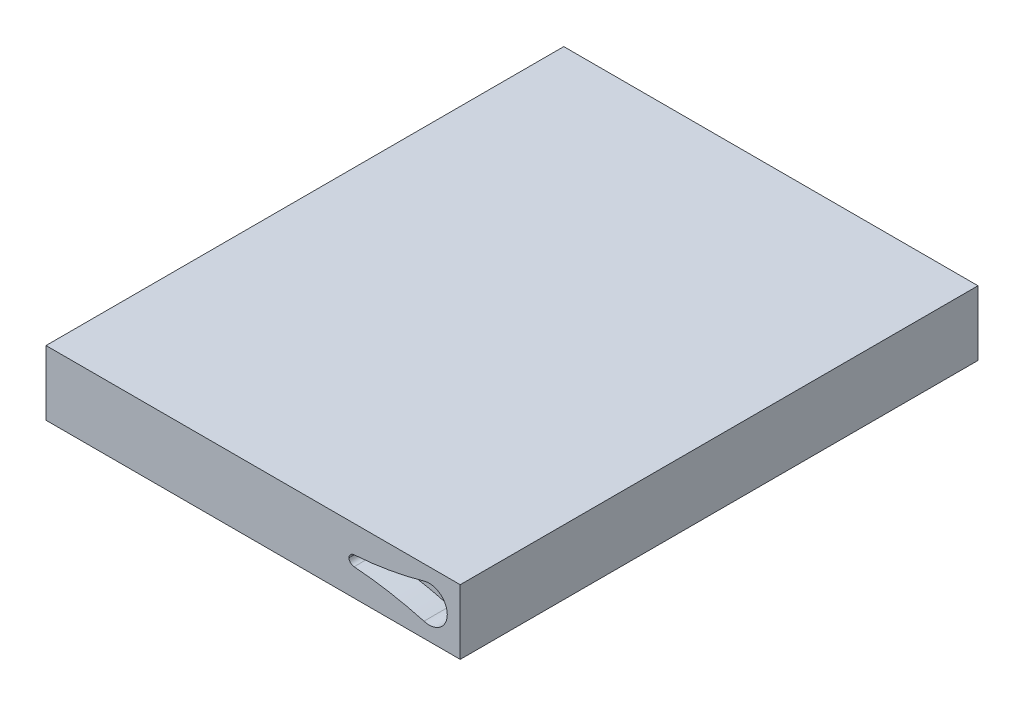
ISO-10303-21;
HEADER;
FILE_DESCRIPTION(('STEP AP214'),'2;1');
FILE_NAME('part.step','',(''),(''),'','','');
FILE_SCHEMA(('AUTOMOTIVE_DESIGN { 1 0 10303 214 1 1 1 1 }'));
ENDSEC;
DATA;
#1=APPLICATION_CONTEXT('core data for automotive mechanical design processes');
#2=APPLICATION_PROTOCOL_DEFINITION('international standard','automotive_design',2000,#1);
#3=PRODUCT_CONTEXT('',#1,'mechanical');
#4=PRODUCT('Part','Part','',(#3));
#5=PRODUCT_RELATED_PRODUCT_CATEGORY('part','',(#4));
#6=PRODUCT_DEFINITION_FORMATION('','',#4);
#7=PRODUCT_DEFINITION_CONTEXT('part definition',#1,'design');
#8=PRODUCT_DEFINITION('design','',#6,#7);
#9=PRODUCT_DEFINITION_SHAPE('','',#8);
#10=(LENGTH_UNIT() NAMED_UNIT(*) SI_UNIT(.MILLI.,.METRE.));
#11=(NAMED_UNIT(*) PLANE_ANGLE_UNIT() SI_UNIT($,.RADIAN.));
#12=(NAMED_UNIT(*) SI_UNIT($,.STERADIAN.) SOLID_ANGLE_UNIT());
#13=UNCERTAINTY_MEASURE_WITH_UNIT(LENGTH_MEASURE(1.E-05),#10,'distance_accuracy_value','');
#14=(GEOMETRIC_REPRESENTATION_CONTEXT(3) GLOBAL_UNCERTAINTY_ASSIGNED_CONTEXT((#13)) GLOBAL_UNIT_ASSIGNED_CONTEXT((#10,
#11,#12)) REPRESENTATION_CONTEXT('',''));
#15=CARTESIAN_POINT('',(0.,0.,0.));
#16=DIRECTION('',(0.,0.,1.));
#17=DIRECTION('',(1.,0.,0.));
#18=AXIS2_PLACEMENT_3D('',#15,#16,#17);
#19=CARTESIAN_POINT('',(0.,12.5,0.));
#20=DIRECTION('',(0.,0.,-1.));
#21=DIRECTION('',(-1.,0.,0.));
#22=AXIS2_PLACEMENT_3D('',#19,#20,#21);
#23=PLANE('',#22);
#24=DIRECTION('',(1.,0.,0.));
#25=VECTOR('',#24,1.);
#26=CARTESIAN_POINT('',(0.,0.,0.));
#27=LINE('',#26,#25);
#28=CARTESIAN_POINT('',(0.,0.,0.));
#29=VERTEX_POINT('',#28);
#30=CARTESIAN_POINT('',(80.,0.,0.));
#31=VERTEX_POINT('',#30);
#32=EDGE_CURVE('E262',#29,#31,#27,.T.);
#33=ORIENTED_EDGE('',*,*,#32,.T.);
#34=DIRECTION('',(0.,-1.,0.));
#35=VECTOR('',#34,1.);
#36=CARTESIAN_POINT('',(80.,12.5,0.));
#37=LINE('',#36,#35);
#38=CARTESIAN_POINT('',(80.,12.5,0.));
#39=VERTEX_POINT('',#38);
#40=EDGE_CURVE('E54',#39,#31,#37,.T.);
#41=ORIENTED_EDGE('',*,*,#40,.F.);
#42=DIRECTION('',(1.,0.,0.));
#43=VECTOR('',#42,1.);
#44=CARTESIAN_POINT('',(0.,12.5,0.));
#45=LINE('',#44,#43);
#46=CARTESIAN_POINT('',(0.,12.5,0.));
#47=VERTEX_POINT('',#46);
#48=EDGE_CURVE('E248',#47,#39,#45,.T.);
#49=ORIENTED_EDGE('',*,*,#48,.F.);
#50=DIRECTION('',(0.,-1.,0.));
#51=VECTOR('',#50,1.);
#52=CARTESIAN_POINT('',(0.,12.5,0.));
#53=LINE('',#52,#51);
#54=EDGE_CURVE('E11',#47,#29,#53,.T.);
#55=ORIENTED_EDGE('',*,*,#54,.T.);
#56=EDGE_LOOP('',(#33,#41,#49,#55));
#57=FACE_BOUND('',#56,.T.);
#58=CARTESIAN_POINT('',(59.5740057832264,6.17599421677323,0.));
#59=DIRECTION('',(0.,0.,1.));
#60=DIRECTION('',(1.,0.,0.));
#61=AXIS2_PLACEMENT_3D('',#58,#59,#60);
#62=CIRCLE('',#61,1.07655249679479);
#63=CARTESIAN_POINT('',(58.4999999999999,6.24999999999999,0.));
#64=VERTEX_POINT('',#63);
#65=CARTESIAN_POINT('',(59.5,7.24999999999981,0.));
#66=VERTEX_POINT('',#65);
#67=EDGE_CURVE('E69',#64,#66,#62,.F.);
#68=ORIENTED_EDGE('',*,*,#67,.T.);
#69=CARTESIAN_POINT('',(54.956020838334,73.1943044277108,0.));
#70=DIRECTION('',(0.,0.,1.));
#71=DIRECTION('',(1.,0.,0.));
#72=AXIS2_PLACEMENT_3D('',#69,#70,#71);
#73=CIRCLE('',#72,66.100673469158);
#74=CARTESIAN_POINT('',(73.,9.60410196624968,0.));
#75=VERTEX_POINT('',#74);
#76=EDGE_CURVE('E196',#66,#75,#73,.T.);
#77=ORIENTED_EDGE('',*,*,#76,.T.);
#78=CARTESIAN_POINT('',(74.,6.25,0.));
#79=DIRECTION('',(0.,0.,1.));
#80=DIRECTION('',(1.,0.,0.));
#81=AXIS2_PLACEMENT_3D('',#78,#79,#80);
#82=CIRCLE('',#81,3.50000000000001);
#83=CARTESIAN_POINT('',(73.,2.89589803375031,0.));
#84=VERTEX_POINT('',#83);
#85=EDGE_CURVE('E222',#84,#75,#82,.T.);
#86=ORIENTED_EDGE('',*,*,#85,.F.);
#87=CARTESIAN_POINT('',(54.2313452927929,-64.8500801778966,0.));
#88=DIRECTION('',(0.,0.,1.));
#89=DIRECTION('',(1.,0.,0.));
#90=AXIS2_PLACEMENT_3D('',#87,#88,#89);
#91=CIRCLE('',#90,70.2977948684829);
#92=CARTESIAN_POINT('',(59.5,5.25000000000005,0.));
#93=VERTEX_POINT('',#92);
#94=EDGE_CURVE('E218',#93,#84,#91,.F.);
#95=ORIENTED_EDGE('',*,*,#94,.F.);
#96=CARTESIAN_POINT('',(59.5812669884853,6.33126698848544,0.));
#97=DIRECTION('',(0.,0.,1.));
#98=DIRECTION('',(1.,0.,0.));
#99=AXIS2_PLACEMENT_3D('',#96,#97,#98);
#100=CIRCLE('',#99,1.08431666214522);
#101=EDGE_CURVE('E214',#64,#93,#100,.T.);
#102=ORIENTED_EDGE('',*,*,#101,.F.);
#103=EDGE_LOOP('',(#68,#77,#86,#95,#102));
#104=FACE_BOUND('',#103,.T.);
#105=ADVANCED_FACE('F45',(#57,#104),#23,.F.);
#106=CARTESIAN_POINT('',(0.,12.5,0.));
#107=DIRECTION('',(1.,0.,0.));
#108=DIRECTION('',(0.,0.,-1.));
#109=AXIS2_PLACEMENT_3D('',#106,#107,#108);
#110=PLANE('',#109);
#111=DIRECTION('',(0.,0.,1.));
#112=VECTOR('',#111,1.);
#113=CARTESIAN_POINT('',(0.,0.,0.));
#114=LINE('',#113,#112);
#115=CARTESIAN_POINT('',(0.,0.,-100.));
#116=VERTEX_POINT('',#115);
#117=EDGE_CURVE('E232',#116,#29,#114,.T.);
#118=ORIENTED_EDGE('',*,*,#117,.T.);
#119=ORIENTED_EDGE('',*,*,#54,.F.);
#120=DIRECTION('',(0.,0.,1.));
#121=VECTOR('',#120,1.);
#122=CARTESIAN_POINT('',(0.,12.5,0.));
#123=LINE('',#122,#121);
#124=CARTESIAN_POINT('',(0.,12.5,-100.));
#125=VERTEX_POINT('',#124);
#126=EDGE_CURVE('E244',#125,#47,#123,.T.);
#127=ORIENTED_EDGE('',*,*,#126,.F.);
#128=DIRECTION('',(0.,-1.,0.));
#129=VECTOR('',#128,1.);
#130=CARTESIAN_POINT('',(0.,12.5,-100.));
#131=LINE('',#130,#129);
#132=EDGE_CURVE('E258',#125,#116,#131,.T.);
#133=ORIENTED_EDGE('',*,*,#132,.T.);
#134=EDGE_LOOP('',(#118,#119,#127,#133));
#135=FACE_BOUND('',#134,.T.);
#136=ADVANCED_FACE('F47',(#135),#110,.F.);
#137=CARTESIAN_POINT('',(80.,12.5,0.));
#138=DIRECTION('',(-1.,0.,0.));
#139=DIRECTION('',(0.,0.,1.));
#140=AXIS2_PLACEMENT_3D('',#137,#138,#139);
#141=PLANE('',#140);
#142=DIRECTION('',(0.,0.,-1.));
#143=VECTOR('',#142,1.);
#144=CARTESIAN_POINT('',(80.,0.,0.));
#145=LINE('',#144,#143);
#146=CARTESIAN_POINT('',(80.,0.,-100.));
#147=VERTEX_POINT('',#146);
#148=EDGE_CURVE('E265',#31,#147,#145,.T.);
#149=ORIENTED_EDGE('',*,*,#148,.T.);
#150=DIRECTION('',(0.,-1.,0.));
#151=VECTOR('',#150,1.);
#152=CARTESIAN_POINT('',(80.,12.5,-100.));
#153=LINE('',#152,#151);
#154=CARTESIAN_POINT('',(80.,12.5,-100.));
#155=VERTEX_POINT('',#154);
#156=EDGE_CURVE('E273',#155,#147,#153,.T.);
#157=ORIENTED_EDGE('',*,*,#156,.F.);
#158=DIRECTION('',(0.,0.,-1.));
#159=VECTOR('',#158,1.);
#160=CARTESIAN_POINT('',(80.,12.5,0.));
#161=LINE('',#160,#159);
#162=EDGE_CURVE('E252',#39,#155,#161,.T.);
#163=ORIENTED_EDGE('',*,*,#162,.F.);
#164=ORIENTED_EDGE('',*,*,#40,.T.);
#165=EDGE_LOOP('',(#149,#157,#163,#164));
#166=FACE_BOUND('',#165,.T.);
#167=ADVANCED_FACE('F282',(#166),#141,.F.);
#168=CARTESIAN_POINT('',(0.,12.5,-100.));
#169=DIRECTION('',(0.,0.,1.));
#170=DIRECTION('',(1.,0.,0.));
#171=AXIS2_PLACEMENT_3D('',#168,#169,#170);
#172=PLANE('',#171);
#173=CARTESIAN_POINT('',(74.,6.25,-100.));
#174=DIRECTION('',(0.,0.,1.));
#175=DIRECTION('',(1.,0.,0.));
#176=AXIS2_PLACEMENT_3D('',#173,#174,#175);
#177=CIRCLE('',#176,3.50000000000001);
#178=CARTESIAN_POINT('',(73.,9.60410196624969,-100.));
#179=VERTEX_POINT('',#178);
#180=CARTESIAN_POINT('',(73.,2.89589803375032,-100.));
#181=VERTEX_POINT('',#180);
#182=EDGE_CURVE('E165',#179,#181,#177,.F.);
#183=ORIENTED_EDGE('',*,*,#182,.F.);
#184=CARTESIAN_POINT('',(59.4999965987618,47.0919558498584,-100.));
#185=DIRECTION('',(0.,0.,1.));
#186=DIRECTION('',(1.,0.,0.));
#187=AXIS2_PLACEMENT_3D('',#184,#185,#186);
#188=CIRCLE('',#187,39.8445640035405);
#189=CARTESIAN_POINT('',(59.4999965987614,7.24739184631785,-100.));
#190=VERTEX_POINT('',#189);
#191=EDGE_CURVE('E61',#190,#179,#188,.T.);
#192=ORIENTED_EDGE('',*,*,#191,.F.);
#193=CARTESIAN_POINT('',(59.4999965987614,6.24739184631786,-100.));
#194=DIRECTION('',(0.,0.,1.));
#195=DIRECTION('',(1.,0.,0.));
#196=AXIS2_PLACEMENT_3D('',#193,#194,#195);
#197=CIRCLE('',#196,0.999999999999992);
#198=CARTESIAN_POINT('',(59.4999965987614,5.24739184631786,-100.));
#199=VERTEX_POINT('',#198);
#200=EDGE_CURVE('E147',#190,#199,#197,.T.);
#201=ORIENTED_EDGE('',*,*,#200,.T.);
#202=CARTESIAN_POINT('',(59.4999965987614,-34.680337068045,-100.));
#203=DIRECTION('',(0.,0.,1.));
#204=DIRECTION('',(1.,0.,0.));
#205=AXIS2_PLACEMENT_3D('',#202,#203,#204);
#206=CIRCLE('',#205,39.9277289143629);
#207=EDGE_CURVE('E169',#199,#181,#206,.F.);
#208=ORIENTED_EDGE('',*,*,#207,.T.);
#209=EDGE_LOOP('',(#183,#192,#201,#208));
#210=FACE_BOUND('',#209,.T.);
#211=DIRECTION('',(-1.,0.,0.));
#212=VECTOR('',#211,1.);
#213=CARTESIAN_POINT('',(0.,0.,-100.));
#214=LINE('',#213,#212);
#215=EDGE_CURVE('E249',#147,#116,#214,.T.);
#216=ORIENTED_EDGE('',*,*,#215,.T.);
#217=ORIENTED_EDGE('',*,*,#132,.F.);
#218=DIRECTION('',(-1.,0.,0.));
#219=VECTOR('',#218,1.);
#220=CARTESIAN_POINT('',(0.,12.5,-100.));
#221=LINE('',#220,#219);
#222=EDGE_CURVE('E255',#155,#125,#221,.T.);
#223=ORIENTED_EDGE('',*,*,#222,.F.);
#224=ORIENTED_EDGE('',*,*,#156,.T.);
#225=EDGE_LOOP('',(#216,#217,#223,#224));
#226=FACE_BOUND('',#225,.T.);
#227=ADVANCED_FACE('F291',(#210,#226),#172,.F.);
#228=CARTESIAN_POINT('',(0.,12.5,0.));
#229=DIRECTION('',(0.,-1.,0.));
#230=DIRECTION('',(0.,0.,-1.));
#231=AXIS2_PLACEMENT_3D('',#228,#229,#230);
#232=PLANE('',#231);
#233=ORIENTED_EDGE('',*,*,#126,.T.);
#234=ORIENTED_EDGE('',*,*,#48,.T.);
#235=ORIENTED_EDGE('',*,*,#162,.T.);
#236=ORIENTED_EDGE('',*,*,#222,.T.);
#237=EDGE_LOOP('',(#233,#234,#235,#236));
#238=FACE_BOUND('',#237,.T.);
#239=ADVANCED_FACE('F297',(#238),#232,.F.);
#240=CARTESIAN_POINT('',(0.,0.,0.));
#241=DIRECTION('',(0.,-1.,0.));
#242=DIRECTION('',(0.,0.,-1.));
#243=AXIS2_PLACEMENT_3D('',#240,#241,#242);
#244=PLANE('',#243);
#245=ORIENTED_EDGE('',*,*,#117,.F.);
#246=ORIENTED_EDGE('',*,*,#215,.F.);
#247=ORIENTED_EDGE('',*,*,#148,.F.);
#248=ORIENTED_EDGE('',*,*,#32,.F.);
#249=EDGE_LOOP('',(#245,#246,#247,#248));
#250=FACE_BOUND('',#249,.T.);
#251=ADVANCED_FACE('F288',(#250),#244,.T.);
#252=CARTESIAN_POINT('',(59.5740057832264,6.17599421677323,-5.));
#253=DIRECTION('',(0.,0.,1.));
#254=DIRECTION('',(1.,0.,0.));
#255=AXIS2_PLACEMENT_3D('',#252,#253,#254);
#256=CYLINDRICAL_SURFACE('',#255,1.07655249679479);
#257=ORIENTED_EDGE('',*,*,#67,.F.);
#258=DIRECTION('',(0.,0.,1.));
#259=VECTOR('',#258,1.);
#260=CARTESIAN_POINT('',(58.5,6.25,-5.));
#261=LINE('',#260,#259);
#262=CARTESIAN_POINT('',(58.5,6.25,-5.));
#263=VERTEX_POINT('',#262);
#264=EDGE_CURVE('E211',#263,#64,#261,.T.);
#265=ORIENTED_EDGE('',*,*,#264,.F.);
#266=CARTESIAN_POINT('',(59.5740057832264,6.17599421677323,-5.));
#267=DIRECTION('',(0.,0.,1.));
#268=DIRECTION('',(1.,0.,0.));
#269=AXIS2_PLACEMENT_3D('',#266,#267,#268);
#270=CIRCLE('',#269,1.07655249679479);
#271=CARTESIAN_POINT('',(59.5,7.24999999999981,-5.));
#272=VERTEX_POINT('',#271);
#273=EDGE_CURVE('E191',#263,#272,#270,.F.);
#274=ORIENTED_EDGE('',*,*,#273,.T.);
#275=DIRECTION('',(0.,0.,1.));
#276=VECTOR('',#275,1.);
#277=CARTESIAN_POINT('',(59.5,7.24999999999981,-5.));
#278=LINE('',#277,#276);
#279=EDGE_CURVE('E229',#272,#66,#278,.T.);
#280=ORIENTED_EDGE('',*,*,#279,.T.);
#281=EDGE_LOOP('',(#257,#265,#274,#280));
#282=FACE_BOUND('',#281,.T.);
#283=ADVANCED_FACE('F308',(#282),#256,.F.);
#284=CARTESIAN_POINT('',(54.956020838334,73.1943044277108,-5.));
#285=DIRECTION('',(0.,0.,1.));
#286=DIRECTION('',(1.,0.,0.));
#287=AXIS2_PLACEMENT_3D('',#284,#285,#286);
#288=CYLINDRICAL_SURFACE('',#287,66.100673469158);
#289=ORIENTED_EDGE('',*,*,#76,.F.);
#290=ORIENTED_EDGE('',*,*,#279,.F.);
#291=CARTESIAN_POINT('',(54.956020838334,73.1943044277108,-5.));
#292=DIRECTION('',(0.,0.,1.));
#293=DIRECTION('',(1.,0.,0.));
#294=AXIS2_PLACEMENT_3D('',#291,#292,#293);
#295=CIRCLE('',#294,66.100673469158);
#296=CARTESIAN_POINT('',(73.,9.60410196624968,-5.));
#297=VERTEX_POINT('',#296);
#298=EDGE_CURVE('E208',#272,#297,#295,.T.);
#299=ORIENTED_EDGE('',*,*,#298,.T.);
#300=DIRECTION('',(0.,0.,1.));
#301=VECTOR('',#300,1.);
#302=CARTESIAN_POINT('',(73.,9.60410196624968,-5.));
#303=LINE('',#302,#301);
#304=EDGE_CURVE('E233',#297,#75,#303,.T.);
#305=ORIENTED_EDGE('',*,*,#304,.T.);
#306=EDGE_LOOP('',(#289,#290,#299,#305));
#307=FACE_BOUND('',#306,.T.);
#308=ADVANCED_FACE('F315',(#307),#288,.T.);
#309=CARTESIAN_POINT('',(74.,6.25,-5.));
#310=DIRECTION('',(0.,0.,1.));
#311=DIRECTION('',(1.,0.,0.));
#312=AXIS2_PLACEMENT_3D('',#309,#310,#311);
#313=CYLINDRICAL_SURFACE('',#312,3.50000000000001);
#314=ORIENTED_EDGE('',*,*,#85,.T.);
#315=ORIENTED_EDGE('',*,*,#304,.F.);
#316=CARTESIAN_POINT('',(74.,6.25,-5.));
#317=DIRECTION('',(0.,0.,1.));
#318=DIRECTION('',(1.,0.,0.));
#319=AXIS2_PLACEMENT_3D('',#316,#317,#318);
#320=CIRCLE('',#319,3.50000000000001);
#321=CARTESIAN_POINT('',(73.,2.89589803375031,-5.));
#322=VERTEX_POINT('',#321);
#323=EDGE_CURVE('E204',#322,#297,#320,.T.);
#324=ORIENTED_EDGE('',*,*,#323,.F.);
#325=DIRECTION('',(0.,0.,1.));
#326=VECTOR('',#325,1.);
#327=CARTESIAN_POINT('',(73.,2.89589803375031,-5.));
#328=LINE('',#327,#326);
#329=EDGE_CURVE('E236',#322,#84,#328,.T.);
#330=ORIENTED_EDGE('',*,*,#329,.T.);
#331=EDGE_LOOP('',(#314,#315,#324,#330));
#332=FACE_BOUND('',#331,.T.);
#333=ADVANCED_FACE('F317',(#332),#313,.F.);
#334=CARTESIAN_POINT('',(54.2313452927929,-64.8500801778966,-5.));
#335=DIRECTION('',(0.,0.,1.));
#336=DIRECTION('',(1.,0.,0.));
#337=AXIS2_PLACEMENT_3D('',#334,#335,#336);
#338=CYLINDRICAL_SURFACE('',#337,70.2977948684829);
#339=ORIENTED_EDGE('',*,*,#94,.T.);
#340=ORIENTED_EDGE('',*,*,#329,.F.);
#341=CARTESIAN_POINT('',(54.2313452927929,-64.8500801778966,-5.));
#342=DIRECTION('',(0.,0.,1.));
#343=DIRECTION('',(1.,0.,0.));
#344=AXIS2_PLACEMENT_3D('',#341,#342,#343);
#345=CIRCLE('',#344,70.2977948684829);
#346=CARTESIAN_POINT('',(59.5,5.25000000000005,-5.));
#347=VERTEX_POINT('',#346);
#348=EDGE_CURVE('E200',#347,#322,#345,.F.);
#349=ORIENTED_EDGE('',*,*,#348,.F.);
#350=DIRECTION('',(0.,0.,1.));
#351=VECTOR('',#350,1.);
#352=CARTESIAN_POINT('',(59.5,5.25000000000005,-5.));
#353=LINE('',#352,#351);
#354=EDGE_CURVE('E239',#347,#93,#353,.T.);
#355=ORIENTED_EDGE('',*,*,#354,.T.);
#356=EDGE_LOOP('',(#339,#340,#349,#355));
#357=FACE_BOUND('',#356,.T.);
#358=ADVANCED_FACE('F319',(#357),#338,.T.);
#359=CARTESIAN_POINT('',(59.5812669884853,6.33126698848544,-5.));
#360=DIRECTION('',(0.,0.,1.));
#361=DIRECTION('',(1.,0.,0.));
#362=AXIS2_PLACEMENT_3D('',#359,#360,#361);
#363=CYLINDRICAL_SURFACE('',#362,1.08431666214522);
#364=ORIENTED_EDGE('',*,*,#101,.T.);
#365=ORIENTED_EDGE('',*,*,#354,.F.);
#366=CARTESIAN_POINT('',(59.5812669884853,6.33126698848544,-5.));
#367=DIRECTION('',(0.,0.,1.));
#368=DIRECTION('',(1.,0.,0.));
#369=AXIS2_PLACEMENT_3D('',#366,#367,#368);
#370=CIRCLE('',#369,1.08431666214522);
#371=EDGE_CURVE('E195',#263,#347,#370,.T.);
#372=ORIENTED_EDGE('',*,*,#371,.F.);
#373=ORIENTED_EDGE('',*,*,#264,.T.);
#374=EDGE_LOOP('',(#364,#365,#372,#373));
#375=FACE_BOUND('',#374,.T.);
#376=ADVANCED_FACE('F304',(#375),#363,.F.);
#377=CARTESIAN_POINT('',(0.,0.,-5.));
#378=DIRECTION('',(0.,0.,1.));
#379=DIRECTION('',(1.,0.,0.));
#380=AXIS2_PLACEMENT_3D('',#377,#378,#379);
#381=PLANE('',#380);
#382=ORIENTED_EDGE('',*,*,#273,.F.);
#383=ORIENTED_EDGE('',*,*,#371,.T.);
#384=ORIENTED_EDGE('',*,*,#348,.T.);
#385=ORIENTED_EDGE('',*,*,#323,.T.);
#386=ORIENTED_EDGE('',*,*,#298,.F.);
#387=EDGE_LOOP('',(#382,#383,#384,#385,#386));
#388=FACE_BOUND('',#387,.T.);
#389=ADVANCED_FACE('F311',(#388),#381,.T.);
#390=CARTESIAN_POINT('',(59.4999965987618,47.0919558498584,-95.));
#391=DIRECTION('',(0.,0.,-1.));
#392=DIRECTION('',(-1.,0.,0.));
#393=AXIS2_PLACEMENT_3D('',#390,#391,#392);
#394=CYLINDRICAL_SURFACE('',#393,39.8445640035405);
#395=ORIENTED_EDGE('',*,*,#191,.T.);
#396=DIRECTION('',(0.,0.,-1.));
#397=VECTOR('',#396,1.);
#398=CARTESIAN_POINT('',(73.,9.60410196624969,-95.));
#399=LINE('',#398,#397);
#400=CARTESIAN_POINT('',(73.,9.60410196624969,-95.));
#401=VERTEX_POINT('',#400);
#402=EDGE_CURVE('E163',#401,#179,#399,.T.);
#403=ORIENTED_EDGE('',*,*,#402,.F.);
#404=CARTESIAN_POINT('',(59.4999965987618,47.0919558498584,-95.));
#405=DIRECTION('',(0.,0.,1.));
#406=DIRECTION('',(1.,0.,0.));
#407=AXIS2_PLACEMENT_3D('',#404,#405,#406);
#408=CIRCLE('',#407,39.8445640035405);
#409=CARTESIAN_POINT('',(59.4999965987614,7.24739184631785,-95.));
#410=VERTEX_POINT('',#409);
#411=EDGE_CURVE('E157',#410,#401,#408,.T.);
#412=ORIENTED_EDGE('',*,*,#411,.F.);
#413=DIRECTION('',(0.,0.,-1.));
#414=VECTOR('',#413,1.);
#415=CARTESIAN_POINT('',(59.4999965987614,7.24739184631785,-95.));
#416=LINE('',#415,#414);
#417=EDGE_CURVE('E141',#410,#190,#416,.T.);
#418=ORIENTED_EDGE('',*,*,#417,.T.);
#419=EDGE_LOOP('',(#395,#403,#412,#418));
#420=FACE_BOUND('',#419,.T.);
#421=ADVANCED_FACE('F162',(#420),#394,.T.);
#422=CARTESIAN_POINT('',(59.4999965987614,6.24739184631786,-95.));
#423=DIRECTION('',(0.,0.,-1.));
#424=DIRECTION('',(-1.,0.,0.));
#425=AXIS2_PLACEMENT_3D('',#422,#423,#424);
#426=CYLINDRICAL_SURFACE('',#425,0.999999999999992);
#427=ORIENTED_EDGE('',*,*,#200,.F.);
#428=ORIENTED_EDGE('',*,*,#417,.F.);
#429=CARTESIAN_POINT('',(59.4999965987614,6.24739184631786,-95.));
#430=DIRECTION('',(0.,0.,1.));
#431=DIRECTION('',(1.,0.,0.));
#432=AXIS2_PLACEMENT_3D('',#429,#430,#431);
#433=CIRCLE('',#432,0.999999999999992);
#434=CARTESIAN_POINT('',(59.4999965987614,5.24739184631786,-95.));
#435=VERTEX_POINT('',#434);
#436=EDGE_CURVE('E144',#410,#435,#433,.T.);
#437=ORIENTED_EDGE('',*,*,#436,.T.);
#438=DIRECTION('',(0.,0.,-1.));
#439=VECTOR('',#438,1.);
#440=CARTESIAN_POINT('',(59.4999965987614,5.24739184631786,-95.));
#441=LINE('',#440,#439);
#442=EDGE_CURVE('E150',#435,#199,#441,.T.);
#443=ORIENTED_EDGE('',*,*,#442,.T.);
#444=EDGE_LOOP('',(#427,#428,#437,#443));
#445=FACE_BOUND('',#444,.T.);
#446=ADVANCED_FACE('F143',(#445),#426,.F.);
#447=CARTESIAN_POINT('',(59.4999965987614,-34.680337068045,-95.));
#448=DIRECTION('',(0.,0.,-1.));
#449=DIRECTION('',(-1.,0.,0.));
#450=AXIS2_PLACEMENT_3D('',#447,#448,#449);
#451=CYLINDRICAL_SURFACE('',#450,39.9277289143629);
#452=ORIENTED_EDGE('',*,*,#207,.F.);
#453=ORIENTED_EDGE('',*,*,#442,.F.);
#454=CARTESIAN_POINT('',(59.4999965987614,-34.680337068045,-95.));
#455=DIRECTION('',(0.,0.,1.));
#456=DIRECTION('',(1.,0.,0.));
#457=AXIS2_PLACEMENT_3D('',#454,#455,#456);
#458=CIRCLE('',#457,39.9277289143629);
#459=CARTESIAN_POINT('',(73.,2.89589803375032,-95.));
#460=VERTEX_POINT('',#459);
#461=EDGE_CURVE('E159',#435,#460,#458,.F.);
#462=ORIENTED_EDGE('',*,*,#461,.T.);
#463=DIRECTION('',(0.,0.,-1.));
#464=VECTOR('',#463,1.);
#465=CARTESIAN_POINT('',(73.,2.89589803375032,-95.));
#466=LINE('',#465,#464);
#467=EDGE_CURVE('E186',#460,#181,#466,.T.);
#468=ORIENTED_EDGE('',*,*,#467,.T.);
#469=EDGE_LOOP('',(#452,#453,#462,#468));
#470=FACE_BOUND('',#469,.T.);
#471=ADVANCED_FACE('F436',(#470),#451,.T.);
#472=CARTESIAN_POINT('',(74.,6.25,-95.));
#473=DIRECTION('',(0.,0.,-1.));
#474=DIRECTION('',(-1.,0.,0.));
#475=AXIS2_PLACEMENT_3D('',#472,#473,#474);
#476=CYLINDRICAL_SURFACE('',#475,3.50000000000001);
#477=ORIENTED_EDGE('',*,*,#182,.T.);
#478=ORIENTED_EDGE('',*,*,#467,.F.);
#479=CARTESIAN_POINT('',(74.,6.25,-95.));
#480=DIRECTION('',(0.,0.,1.));
#481=DIRECTION('',(1.,0.,0.));
#482=AXIS2_PLACEMENT_3D('',#479,#480,#481);
#483=CIRCLE('',#482,3.50000000000001);
#484=EDGE_CURVE('E174',#401,#460,#483,.F.);
#485=ORIENTED_EDGE('',*,*,#484,.F.);
#486=ORIENTED_EDGE('',*,*,#402,.T.);
#487=EDGE_LOOP('',(#477,#478,#485,#486));
#488=FACE_BOUND('',#487,.T.);
#489=ADVANCED_FACE('F448',(#488),#476,.F.);
#490=CARTESIAN_POINT('',(0.,0.,-95.));
#491=DIRECTION('',(0.,0.,1.));
#492=DIRECTION('',(1.,0.,0.));
#493=AXIS2_PLACEMENT_3D('',#490,#491,#492);
#494=PLANE('',#493);
#495=ORIENTED_EDGE('',*,*,#411,.T.);
#496=ORIENTED_EDGE('',*,*,#484,.T.);
#497=ORIENTED_EDGE('',*,*,#461,.F.);
#498=ORIENTED_EDGE('',*,*,#436,.F.);
#499=EDGE_LOOP('',(#495,#496,#497,#498));
#500=FACE_BOUND('',#499,.T.);
#501=ADVANCED_FACE('F155',(#500),#494,.F.);
#502=CLOSED_SHELL('',(#105,#136,#167,#227,#239,#251,#283,#308,#333,#358,#376,#389,#421,#446,
#471,#489,#501));
#503=MANIFOLD_SOLID_BREP('B2',#502);
#504=ADVANCED_BREP_SHAPE_REPRESENTATION('',(#18,#503),#14);
#505=SHAPE_DEFINITION_REPRESENTATION(#9,#504);
ENDSEC;
END-ISO-10303-21;
